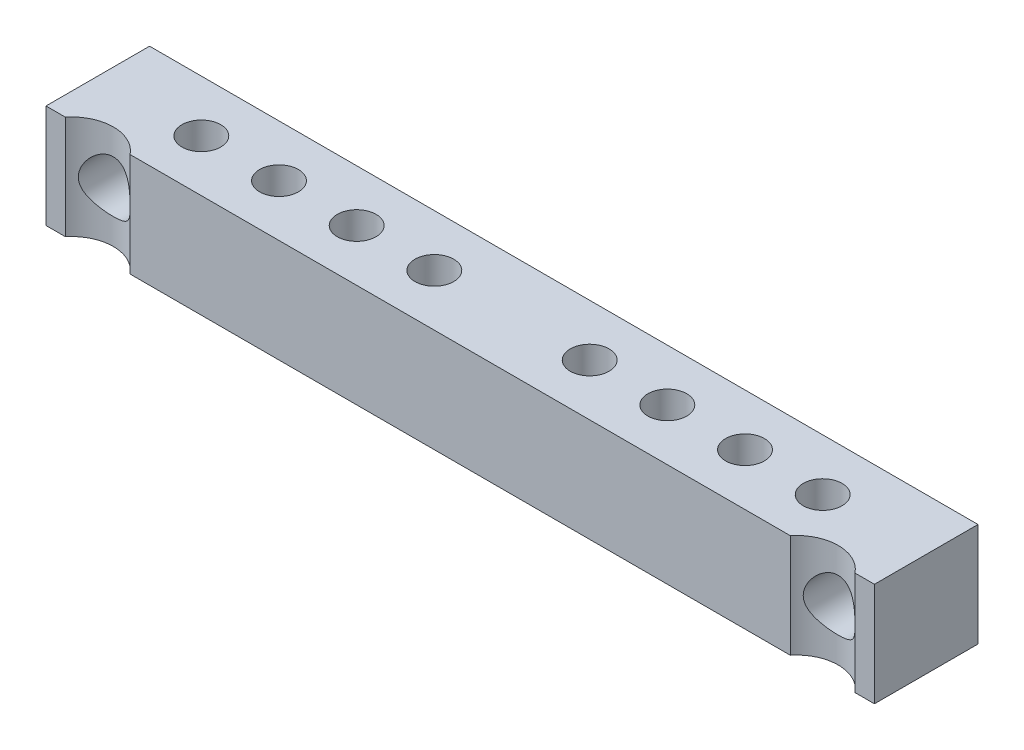
ISO-10303-21;
HEADER;
FILE_DESCRIPTION(('STEP AP214'),'2;1');
FILE_NAME('part.step','',(''),(''),'','','');
FILE_SCHEMA(('AUTOMOTIVE_DESIGN { 1 0 10303 214 1 1 1 1 }'));
ENDSEC;
DATA;
#1=APPLICATION_CONTEXT('core data for automotive mechanical design processes');
#2=APPLICATION_PROTOCOL_DEFINITION('international standard','automotive_design',2000,#1);
#3=PRODUCT_CONTEXT('',#1,'mechanical');
#4=PRODUCT('Part','Part','',(#3));
#5=PRODUCT_RELATED_PRODUCT_CATEGORY('part','',(#4));
#6=PRODUCT_DEFINITION_FORMATION('','',#4);
#7=PRODUCT_DEFINITION_CONTEXT('part definition',#1,'design');
#8=PRODUCT_DEFINITION('design','',#6,#7);
#9=PRODUCT_DEFINITION_SHAPE('','',#8);
#10=(LENGTH_UNIT() NAMED_UNIT(*) SI_UNIT(.MILLI.,.METRE.));
#11=(NAMED_UNIT(*) PLANE_ANGLE_UNIT() SI_UNIT($,.RADIAN.));
#12=(NAMED_UNIT(*) SI_UNIT($,.STERADIAN.) SOLID_ANGLE_UNIT());
#13=UNCERTAINTY_MEASURE_WITH_UNIT(LENGTH_MEASURE(1.E-05),#10,'distance_accuracy_value','');
#14=(GEOMETRIC_REPRESENTATION_CONTEXT(3) GLOBAL_UNCERTAINTY_ASSIGNED_CONTEXT((#13)) GLOBAL_UNIT_ASSIGNED_CONTEXT((#10,
#11,#12)) REPRESENTATION_CONTEXT('',''));
#15=CARTESIAN_POINT('',(0.,0.,0.));
#16=DIRECTION('',(0.,0.,1.));
#17=DIRECTION('',(1.,0.,0.));
#18=AXIS2_PLACEMENT_3D('',#15,#16,#17);
#19=CARTESIAN_POINT('',(0.,0.,4.));
#20=DIRECTION('',(0.,0.,-1.));
#21=DIRECTION('',(-1.,0.,0.));
#22=AXIS2_PLACEMENT_3D('',#19,#20,#21);
#23=PLANE('',#22);
#24=DIRECTION('',(-1.,0.,0.));
#25=VECTOR('',#24,1.);
#26=CARTESIAN_POINT('',(0.,4.,4.));
#27=LINE('',#26,#25);
#28=CARTESIAN_POINT('',(32.,4.,4.));
#29=VERTEX_POINT('',#28);
#30=CARTESIAN_POINT('',(31.2489995996797,4.,4.));
#31=VERTEX_POINT('',#30);
#32=EDGE_CURVE('E126',#29,#31,#27,.T.);
#33=ORIENTED_EDGE('',*,*,#32,.T.);
#34=DIRECTION('',(0.,-1.,0.));
#35=VECTOR('',#34,1.);
#36=CARTESIAN_POINT('',(31.2489995996797,4.,4.));
#37=LINE('',#36,#35);
#38=CARTESIAN_POINT('',(31.2489995996797,0.,4.));
#39=VERTEX_POINT('',#38);
#40=EDGE_CURVE('E63',#31,#39,#37,.T.);
#41=ORIENTED_EDGE('',*,*,#40,.T.);
#42=DIRECTION('',(1.,0.,0.));
#43=VECTOR('',#42,1.);
#44=CARTESIAN_POINT('',(0.,0.,4.));
#45=LINE('',#44,#43);
#46=CARTESIAN_POINT('',(32.,0.,4.));
#47=VERTEX_POINT('',#46);
#48=EDGE_CURVE('E221',#39,#47,#45,.T.);
#49=ORIENTED_EDGE('',*,*,#48,.T.);
#50=DIRECTION('',(0.,1.,0.));
#51=VECTOR('',#50,1.);
#52=CARTESIAN_POINT('',(32.,0.,4.));
#53=LINE('',#52,#51);
#54=EDGE_CURVE('E130',#47,#29,#53,.T.);
#55=ORIENTED_EDGE('',*,*,#54,.T.);
#56=EDGE_LOOP('',(#33,#41,#49,#55));
#57=FACE_BOUND('',#56,.T.);
#58=ADVANCED_FACE('F33',(#57),#23,.F.);
#59=CARTESIAN_POINT('',(3.24899959967968,0.,4.));
#60=VERTEX_POINT('',#59);
#61=CARTESIAN_POINT('',(28.7510004003203,0.,4.));
#62=VERTEX_POINT('',#61);
#63=EDGE_CURVE('E120',#60,#62,#45,.T.);
#64=ORIENTED_EDGE('',*,*,#63,.T.);
#65=DIRECTION('',(0.,-1.,0.));
#66=VECTOR('',#65,1.);
#67=CARTESIAN_POINT('',(28.7510004003203,4.,4.));
#68=LINE('',#67,#66);
#69=CARTESIAN_POINT('',(28.7510004003203,4.,4.));
#70=VERTEX_POINT('',#69);
#71=EDGE_CURVE('E105',#62,#70,#68,.F.);
#72=ORIENTED_EDGE('',*,*,#71,.T.);
#73=CARTESIAN_POINT('',(3.24899959967968,4.,4.));
#74=VERTEX_POINT('',#73);
#75=EDGE_CURVE('E118',#70,#74,#27,.T.);
#76=ORIENTED_EDGE('',*,*,#75,.T.);
#77=DIRECTION('',(0.,-1.,0.));
#78=VECTOR('',#77,1.);
#79=CARTESIAN_POINT('',(3.24899959967968,4.,4.));
#80=LINE('',#79,#78);
#81=EDGE_CURVE('E55',#74,#60,#80,.T.);
#82=ORIENTED_EDGE('',*,*,#81,.T.);
#83=EDGE_LOOP('',(#64,#72,#76,#82));
#84=FACE_BOUND('',#83,.T.);
#85=ADVANCED_FACE('F117',(#84),#23,.F.);
#86=CARTESIAN_POINT('',(0.,0.,4.));
#87=VERTEX_POINT('',#86);
#88=CARTESIAN_POINT('',(0.751000400320319,0.,4.));
#89=VERTEX_POINT('',#88);
#90=EDGE_CURVE('E215',#87,#89,#45,.T.);
#91=ORIENTED_EDGE('',*,*,#90,.T.);
#92=DIRECTION('',(0.,-1.,0.));
#93=VECTOR('',#92,1.);
#94=CARTESIAN_POINT('',(0.751000400320319,4.,4.));
#95=LINE('',#94,#93);
#96=CARTESIAN_POINT('',(0.751000400320319,4.,4.));
#97=VERTEX_POINT('',#96);
#98=EDGE_CURVE('E216',#89,#97,#95,.F.);
#99=ORIENTED_EDGE('',*,*,#98,.T.);
#100=CARTESIAN_POINT('',(0.,4.,4.));
#101=VERTEX_POINT('',#100);
#102=EDGE_CURVE('E127',#97,#101,#27,.T.);
#103=ORIENTED_EDGE('',*,*,#102,.T.);
#104=DIRECTION('',(0.,-1.,0.));
#105=VECTOR('',#104,1.);
#106=CARTESIAN_POINT('',(0.,0.,4.));
#107=LINE('',#106,#105);
#108=EDGE_CURVE('E144',#101,#87,#107,.T.);
#109=ORIENTED_EDGE('',*,*,#108,.T.);
#110=EDGE_LOOP('',(#91,#99,#103,#109));
#111=FACE_BOUND('',#110,.T.);
#112=ADVANCED_FACE('F200',(#111),#23,.F.);
#113=CARTESIAN_POINT('',(0.,0.,0.));
#114=DIRECTION('',(0.,0.,-1.));
#115=DIRECTION('',(-1.,0.,0.));
#116=AXIS2_PLACEMENT_3D('',#113,#114,#115);
#117=PLANE('',#116);
#118=CARTESIAN_POINT('',(2.,2.,0.));
#119=DIRECTION('',(0.,0.,1.));
#120=DIRECTION('',(1.,0.,0.));
#121=AXIS2_PLACEMENT_3D('',#118,#119,#120);
#122=CIRCLE('',#121,1.);
#123=CARTESIAN_POINT('',(3.,2.,0.));
#124=VERTEX_POINT('',#123);
#125=EDGE_CURVE('E138',#124,#124,#122,.T.);
#126=ORIENTED_EDGE('',*,*,#125,.T.);
#127=EDGE_LOOP('',(#126));
#128=FACE_BOUND('',#127,.T.);
#129=DIRECTION('',(0.,-1.,0.));
#130=VECTOR('',#129,1.);
#131=CARTESIAN_POINT('',(0.,0.,0.));
#132=LINE('',#131,#130);
#133=CARTESIAN_POINT('',(0.,4.,0.));
#134=VERTEX_POINT('',#133);
#135=CARTESIAN_POINT('',(0.,0.,0.));
#136=VERTEX_POINT('',#135);
#137=EDGE_CURVE('E134',#134,#136,#132,.T.);
#138=ORIENTED_EDGE('',*,*,#137,.F.);
#139=DIRECTION('',(-1.,0.,0.));
#140=VECTOR('',#139,1.);
#141=CARTESIAN_POINT('',(0.,4.,0.));
#142=LINE('',#141,#140);
#143=CARTESIAN_POINT('',(32.,4.,0.));
#144=VERTEX_POINT('',#143);
#145=EDGE_CURVE('E142',#144,#134,#142,.T.);
#146=ORIENTED_EDGE('',*,*,#145,.F.);
#147=DIRECTION('',(0.,1.,0.));
#148=VECTOR('',#147,1.);
#149=CARTESIAN_POINT('',(32.,0.,0.));
#150=LINE('',#149,#148);
#151=CARTESIAN_POINT('',(32.,0.,0.));
#152=VERTEX_POINT('',#151);
#153=EDGE_CURVE('E140',#152,#144,#150,.T.);
#154=ORIENTED_EDGE('',*,*,#153,.F.);
#155=DIRECTION('',(1.,0.,0.));
#156=VECTOR('',#155,1.);
#157=CARTESIAN_POINT('',(0.,0.,0.));
#158=LINE('',#157,#156);
#159=EDGE_CURVE('E137',#136,#152,#158,.T.);
#160=ORIENTED_EDGE('',*,*,#159,.F.);
#161=EDGE_LOOP('',(#138,#146,#154,#160));
#162=FACE_BOUND('',#161,.T.);
#163=CARTESIAN_POINT('',(30.,2.,0.));
#164=DIRECTION('',(0.,0.,1.));
#165=DIRECTION('',(-1.,0.,0.));
#166=AXIS2_PLACEMENT_3D('',#163,#164,#165);
#167=CIRCLE('',#166,1.);
#168=CARTESIAN_POINT('',(29.,2.,0.));
#169=VERTEX_POINT('',#168);
#170=EDGE_CURVE('E228',#169,#169,#167,.T.);
#171=ORIENTED_EDGE('',*,*,#170,.T.);
#172=EDGE_LOOP('',(#171));
#173=FACE_BOUND('',#172,.T.);
#174=ADVANCED_FACE('F206',(#128,#162,#173),#117,.T.);
#175=CARTESIAN_POINT('',(0.,0.,4.));
#176=DIRECTION('',(1.,0.,0.));
#177=DIRECTION('',(0.,0.,-1.));
#178=AXIS2_PLACEMENT_3D('',#175,#176,#177);
#179=PLANE('',#178);
#180=ORIENTED_EDGE('',*,*,#137,.T.);
#181=DIRECTION('',(0.,0.,-1.));
#182=VECTOR('',#181,1.);
#183=CARTESIAN_POINT('',(0.,0.,4.));
#184=LINE('',#183,#182);
#185=EDGE_CURVE('E11',#87,#136,#184,.T.);
#186=ORIENTED_EDGE('',*,*,#185,.F.);
#187=ORIENTED_EDGE('',*,*,#108,.F.);
#188=DIRECTION('',(0.,0.,-1.));
#189=VECTOR('',#188,1.);
#190=CARTESIAN_POINT('',(0.,4.,4.));
#191=LINE('',#190,#189);
#192=EDGE_CURVE('E129',#101,#134,#191,.T.);
#193=ORIENTED_EDGE('',*,*,#192,.T.);
#194=EDGE_LOOP('',(#180,#186,#187,#193));
#195=FACE_BOUND('',#194,.T.);
#196=ADVANCED_FACE('F35',(#195),#179,.F.);
#197=CARTESIAN_POINT('',(0.,0.,4.));
#198=DIRECTION('',(0.,1.,0.));
#199=DIRECTION('',(-1.,0.,0.));
#200=AXIS2_PLACEMENT_3D('',#197,#198,#199);
#201=PLANE('',#200);
#202=CARTESIAN_POINT('',(4.,0.,1.99999999999994));
#203=DIRECTION('',(0.,-1.,0.));
#204=DIRECTION('',(0.,0.,-1.));
#205=AXIS2_PLACEMENT_3D('',#202,#203,#204);
#206=CIRCLE('',#205,0.750000000000001);
#207=CARTESIAN_POINT('',(4.,0.,1.24999999999994));
#208=VERTEX_POINT('',#207);
#209=EDGE_CURVE('E238',#208,#208,#206,.T.);
#210=ORIENTED_EDGE('',*,*,#209,.F.);
#211=EDGE_LOOP('',(#210));
#212=FACE_BOUND('',#211,.T.);
#213=CARTESIAN_POINT('',(13.,0.,2.));
#214=DIRECTION('',(0.,-1.,0.));
#215=DIRECTION('',(0.,0.,-1.));
#216=AXIS2_PLACEMENT_3D('',#213,#214,#215);
#217=CIRCLE('',#216,0.75);
#218=CARTESIAN_POINT('',(13.,0.,1.25));
#219=VERTEX_POINT('',#218);
#220=EDGE_CURVE('E264',#219,#219,#217,.T.);
#221=ORIENTED_EDGE('',*,*,#220,.F.);
#222=EDGE_LOOP('',(#221));
#223=FACE_BOUND('',#222,.T.);
#224=CARTESIAN_POINT('',(25.,0.,1.99999999999996));
#225=DIRECTION('',(0.,-1.,0.));
#226=DIRECTION('',(0.,0.,1.));
#227=AXIS2_PLACEMENT_3D('',#224,#225,#226);
#228=CIRCLE('',#227,0.750000000000002);
#229=CARTESIAN_POINT('',(25.,0.,2.74999999999996));
#230=VERTEX_POINT('',#229);
#231=EDGE_CURVE('E258',#230,#230,#228,.T.);
#232=ORIENTED_EDGE('',*,*,#231,.F.);
#233=EDGE_LOOP('',(#232));
#234=FACE_BOUND('',#233,.T.);
#235=CARTESIAN_POINT('',(10.,0.,1.99999999999998));
#236=DIRECTION('',(0.,-1.,0.));
#237=DIRECTION('',(0.,0.,-1.));
#238=AXIS2_PLACEMENT_3D('',#235,#236,#237);
#239=CIRCLE('',#238,0.75);
#240=CARTESIAN_POINT('',(10.,0.,1.24999999999998));
#241=VERTEX_POINT('',#240);
#242=EDGE_CURVE('E252',#241,#241,#239,.T.);
#243=ORIENTED_EDGE('',*,*,#242,.F.);
#244=EDGE_LOOP('',(#243));
#245=FACE_BOUND('',#244,.T.);
#246=CARTESIAN_POINT('',(7.,0.,1.99999999999996));
#247=DIRECTION('',(0.,-1.,0.));
#248=DIRECTION('',(0.,0.,-1.));
#249=AXIS2_PLACEMENT_3D('',#246,#247,#248);
#250=CIRCLE('',#249,0.75);
#251=CARTESIAN_POINT('',(7.,0.,1.24999999999996));
#252=VERTEX_POINT('',#251);
#253=EDGE_CURVE('E245',#252,#252,#250,.T.);
#254=ORIENTED_EDGE('',*,*,#253,.F.);
#255=EDGE_LOOP('',(#254));
#256=FACE_BOUND('',#255,.T.);
#257=CARTESIAN_POINT('',(22.,0.,1.99999999999998));
#258=DIRECTION('',(0.,-1.,0.));
#259=DIRECTION('',(0.,0.,1.));
#260=AXIS2_PLACEMENT_3D('',#257,#258,#259);
#261=CIRCLE('',#260,0.750000000000002);
#262=CARTESIAN_POINT('',(22.,0.,2.74999999999998));
#263=VERTEX_POINT('',#262);
#264=EDGE_CURVE('E280',#263,#263,#261,.T.);
#265=ORIENTED_EDGE('',*,*,#264,.F.);
#266=EDGE_LOOP('',(#265));
#267=FACE_BOUND('',#266,.T.);
#268=CARTESIAN_POINT('',(19.,0.,2.));
#269=DIRECTION('',(0.,-1.,0.));
#270=DIRECTION('',(0.,0.,1.));
#271=AXIS2_PLACEMENT_3D('',#268,#269,#270);
#272=CIRCLE('',#271,0.750000000000002);
#273=CARTESIAN_POINT('',(19.,0.,2.75));
#274=VERTEX_POINT('',#273);
#275=EDGE_CURVE('E111',#274,#274,#272,.T.);
#276=ORIENTED_EDGE('',*,*,#275,.F.);
#277=EDGE_LOOP('',(#276));
#278=FACE_BOUND('',#277,.T.);
#279=CARTESIAN_POINT('',(28.,0.,1.99999999999996));
#280=DIRECTION('',(0.,-1.,0.));
#281=DIRECTION('',(0.,0.,1.));
#282=AXIS2_PLACEMENT_3D('',#279,#280,#281);
#283=CIRCLE('',#282,0.750000000000002);
#284=CARTESIAN_POINT('',(28.,0.,2.74999999999996));
#285=VERTEX_POINT('',#284);
#286=EDGE_CURVE('E244',#285,#285,#283,.T.);
#287=ORIENTED_EDGE('',*,*,#286,.F.);
#288=EDGE_LOOP('',(#287));
#289=FACE_BOUND('',#288,.T.);
#290=ORIENTED_EDGE('',*,*,#48,.F.);
#291=CARTESIAN_POINT('',(30.,0.,5.));
#292=DIRECTION('',(0.,-1.,0.));
#293=DIRECTION('',(0.,0.,1.));
#294=AXIS2_PLACEMENT_3D('',#291,#292,#293);
#295=CIRCLE('',#294,1.60000000000001);
#296=EDGE_CURVE('E112',#62,#39,#295,.T.);
#297=ORIENTED_EDGE('',*,*,#296,.F.);
#298=ORIENTED_EDGE('',*,*,#63,.F.);
#299=CARTESIAN_POINT('',(2.,0.,5.));
#300=DIRECTION('',(0.,-1.,0.));
#301=DIRECTION('',(0.,0.,-1.));
#302=AXIS2_PLACEMENT_3D('',#299,#300,#301);
#303=CIRCLE('',#302,1.6);
#304=EDGE_CURVE('E234',#89,#60,#303,.T.);
#305=ORIENTED_EDGE('',*,*,#304,.F.);
#306=ORIENTED_EDGE('',*,*,#90,.F.);
#307=ORIENTED_EDGE('',*,*,#185,.T.);
#308=ORIENTED_EDGE('',*,*,#159,.T.);
#309=DIRECTION('',(0.,0.,-1.));
#310=VECTOR('',#309,1.);
#311=CARTESIAN_POINT('',(32.,0.,4.));
#312=LINE('',#311,#310);
#313=EDGE_CURVE('E47',#47,#152,#312,.T.);
#314=ORIENTED_EDGE('',*,*,#313,.F.);
#315=EDGE_LOOP('',(#290,#297,#298,#305,#306,#307,#308,#314));
#316=FACE_BOUND('',#315,.T.);
#317=ADVANCED_FACE('F292',(#212,#223,#234,#245,#256,#267,#278,#289,#316),#201,.F.);
#318=CARTESIAN_POINT('',(32.,0.,4.));
#319=DIRECTION('',(-1.,0.,0.));
#320=DIRECTION('',(0.,0.,1.));
#321=AXIS2_PLACEMENT_3D('',#318,#319,#320);
#322=PLANE('',#321);
#323=ORIENTED_EDGE('',*,*,#153,.T.);
#324=DIRECTION('',(0.,0.,-1.));
#325=VECTOR('',#324,1.);
#326=CARTESIAN_POINT('',(32.,4.,4.));
#327=LINE('',#326,#325);
#328=EDGE_CURVE('E147',#29,#144,#327,.T.);
#329=ORIENTED_EDGE('',*,*,#328,.F.);
#330=ORIENTED_EDGE('',*,*,#54,.F.);
#331=ORIENTED_EDGE('',*,*,#313,.T.);
#332=EDGE_LOOP('',(#323,#329,#330,#331));
#333=FACE_BOUND('',#332,.T.);
#334=ADVANCED_FACE('F295',(#333),#322,.F.);
#335=CARTESIAN_POINT('',(0.,4.,4.));
#336=DIRECTION('',(0.,-1.,0.));
#337=DIRECTION('',(1.,0.,0.));
#338=AXIS2_PLACEMENT_3D('',#335,#336,#337);
#339=PLANE('',#338);
#340=CARTESIAN_POINT('',(4.,4.,1.99999999999994));
#341=DIRECTION('',(0.,-1.,0.));
#342=DIRECTION('',(0.,0.,-1.));
#343=AXIS2_PLACEMENT_3D('',#340,#341,#342);
#344=CIRCLE('',#343,0.750000000000001);
#345=CARTESIAN_POINT('',(4.,4.,1.24999999999994));
#346=VERTEX_POINT('',#345);
#347=EDGE_CURVE('E241',#346,#346,#344,.T.);
#348=ORIENTED_EDGE('',*,*,#347,.T.);
#349=EDGE_LOOP('',(#348));
#350=FACE_BOUND('',#349,.T.);
#351=CARTESIAN_POINT('',(13.,4.,2.));
#352=DIRECTION('',(0.,-1.,0.));
#353=DIRECTION('',(0.,0.,-1.));
#354=AXIS2_PLACEMENT_3D('',#351,#352,#353);
#355=CIRCLE('',#354,0.75);
#356=CARTESIAN_POINT('',(13.,4.,1.25));
#357=VERTEX_POINT('',#356);
#358=EDGE_CURVE('E236',#357,#357,#355,.T.);
#359=ORIENTED_EDGE('',*,*,#358,.T.);
#360=EDGE_LOOP('',(#359));
#361=FACE_BOUND('',#360,.T.);
#362=CARTESIAN_POINT('',(25.,4.,1.99999999999996));
#363=DIRECTION('',(0.,-1.,0.));
#364=DIRECTION('',(0.,0.,1.));
#365=AXIS2_PLACEMENT_3D('',#362,#363,#364);
#366=CIRCLE('',#365,0.750000000000002);
#367=CARTESIAN_POINT('',(25.,4.,2.74999999999996));
#368=VERTEX_POINT('',#367);
#369=EDGE_CURVE('E261',#368,#368,#366,.T.);
#370=ORIENTED_EDGE('',*,*,#369,.T.);
#371=EDGE_LOOP('',(#370));
#372=FACE_BOUND('',#371,.T.);
#373=CARTESIAN_POINT('',(10.,4.,1.99999999999998));
#374=DIRECTION('',(0.,-1.,0.));
#375=DIRECTION('',(0.,0.,-1.));
#376=AXIS2_PLACEMENT_3D('',#373,#374,#375);
#377=CIRCLE('',#376,0.75);
#378=CARTESIAN_POINT('',(10.,4.,1.24999999999998));
#379=VERTEX_POINT('',#378);
#380=EDGE_CURVE('E255',#379,#379,#377,.T.);
#381=ORIENTED_EDGE('',*,*,#380,.T.);
#382=EDGE_LOOP('',(#381));
#383=FACE_BOUND('',#382,.T.);
#384=CARTESIAN_POINT('',(7.,4.,1.99999999999996));
#385=DIRECTION('',(0.,-1.,0.));
#386=DIRECTION('',(0.,0.,-1.));
#387=AXIS2_PLACEMENT_3D('',#384,#385,#386);
#388=CIRCLE('',#387,0.75);
#389=CARTESIAN_POINT('',(7.,4.,1.24999999999996));
#390=VERTEX_POINT('',#389);
#391=EDGE_CURVE('E248',#390,#390,#388,.T.);
#392=ORIENTED_EDGE('',*,*,#391,.T.);
#393=EDGE_LOOP('',(#392));
#394=FACE_BOUND('',#393,.T.);
#395=CARTESIAN_POINT('',(22.,4.,1.99999999999998));
#396=DIRECTION('',(0.,-1.,0.));
#397=DIRECTION('',(0.,0.,1.));
#398=AXIS2_PLACEMENT_3D('',#395,#396,#397);
#399=CIRCLE('',#398,0.750000000000002);
#400=CARTESIAN_POINT('',(22.,4.,2.74999999999998));
#401=VERTEX_POINT('',#400);
#402=EDGE_CURVE('E249',#401,#401,#399,.T.);
#403=ORIENTED_EDGE('',*,*,#402,.T.);
#404=EDGE_LOOP('',(#403));
#405=FACE_BOUND('',#404,.T.);
#406=CARTESIAN_POINT('',(19.,4.,2.));
#407=DIRECTION('',(0.,-1.,0.));
#408=DIRECTION('',(0.,0.,1.));
#409=AXIS2_PLACEMENT_3D('',#406,#407,#408);
#410=CIRCLE('',#409,0.750000000000002);
#411=CARTESIAN_POINT('',(19.,4.,2.75));
#412=VERTEX_POINT('',#411);
#413=EDGE_CURVE('E277',#412,#412,#410,.T.);
#414=ORIENTED_EDGE('',*,*,#413,.T.);
#415=EDGE_LOOP('',(#414));
#416=FACE_BOUND('',#415,.T.);
#417=CARTESIAN_POINT('',(28.,4.,1.99999999999996));
#418=DIRECTION('',(0.,-1.,0.));
#419=DIRECTION('',(0.,0.,1.));
#420=AXIS2_PLACEMENT_3D('',#417,#418,#419);
#421=CIRCLE('',#420,0.750000000000002);
#422=CARTESIAN_POINT('',(28.,4.,2.74999999999996));
#423=VERTEX_POINT('',#422);
#424=EDGE_CURVE('E271',#423,#423,#421,.T.);
#425=ORIENTED_EDGE('',*,*,#424,.T.);
#426=EDGE_LOOP('',(#425));
#427=FACE_BOUND('',#426,.T.);
#428=ORIENTED_EDGE('',*,*,#75,.F.);
#429=CARTESIAN_POINT('',(30.,4.,5.));
#430=DIRECTION('',(0.,-1.,0.));
#431=DIRECTION('',(0.,0.,1.));
#432=AXIS2_PLACEMENT_3D('',#429,#430,#431);
#433=CIRCLE('',#432,1.60000000000001);
#434=EDGE_CURVE('E102',#70,#31,#433,.T.);
#435=ORIENTED_EDGE('',*,*,#434,.T.);
#436=ORIENTED_EDGE('',*,*,#32,.F.);
#437=ORIENTED_EDGE('',*,*,#328,.T.);
#438=ORIENTED_EDGE('',*,*,#145,.T.);
#439=ORIENTED_EDGE('',*,*,#192,.F.);
#440=ORIENTED_EDGE('',*,*,#102,.F.);
#441=CARTESIAN_POINT('',(2.,4.,5.));
#442=DIRECTION('',(0.,-1.,0.));
#443=DIRECTION('',(0.,0.,-1.));
#444=AXIS2_PLACEMENT_3D('',#441,#442,#443);
#445=CIRCLE('',#444,1.6);
#446=EDGE_CURVE('E125',#97,#74,#445,.T.);
#447=ORIENTED_EDGE('',*,*,#446,.T.);
#448=EDGE_LOOP('',(#428,#435,#436,#437,#438,#439,#440,#447));
#449=FACE_BOUND('',#448,.T.);
#450=ADVANCED_FACE('F123',(#350,#361,#372,#383,#394,#405,#416,#427,#449),#339,.F.);
#451=CARTESIAN_POINT('',(2.,2.,4.));
#452=DIRECTION('',(0.,0.,-1.));
#453=DIRECTION('',(-1.,0.,0.));
#454=AXIS2_PLACEMENT_3D('',#451,#452,#453);
#455=CYLINDRICAL_SURFACE('',#454,1.);
#456=CARTESIAN_POINT('',(1.,2.,3.75100040032032));
#457=CARTESIAN_POINT('',(1.00000430231612,2.04969622544234,3.75099359941953));
#458=CARTESIAN_POINT('',(1.00373844920268,2.0994702682962,3.7479788583293));
#459=CARTESIAN_POINT('',(1.01840839333653,2.1973410560635,3.73645026235617));
#460=CARTESIAN_POINT('',(1.02936375655559,2.24543286909219,3.72792146828708));
#461=CARTESIAN_POINT('',(1.05769540870503,2.33822585815907,3.70679931736767));
#462=CARTESIAN_POINT('',(1.07501605333772,2.38295248694545,3.69424130065573));
#463=CARTESIAN_POINT('',(1.11542443550461,2.46880708931052,3.66653639428454));
#464=CARTESIAN_POINT('',(1.13851233035127,2.5099349646852,3.65138943401059));
#465=CARTESIAN_POINT('',(1.19340849657309,2.59349212358158,3.61776310900231));
#466=CARTESIAN_POINT('',(1.225971125046,2.63535579266607,3.59910929418123));
#467=CARTESIAN_POINT('',(1.2973530684025,2.71350615931597,3.56197743316098));
#468=CARTESIAN_POINT('',(1.33617777496207,2.74978799782714,3.54349955309336));
#469=CARTESIAN_POINT('',(1.42465066779321,2.8200828681185,3.50616436887192));
#470=CARTESIAN_POINT('',(1.47503954487155,2.85329413448344,3.4875302220684));
#471=CARTESIAN_POINT('',(1.58207674333015,2.91050016381053,3.45453414640688));
#472=CARTESIAN_POINT('',(1.63871879481741,2.934504052601,3.4401679905613));
#473=CARTESIAN_POINT('',(1.75057849731039,2.96998584848565,3.41864126945439));
#474=CARTESIAN_POINT('',(1.80535549116221,2.98248913311755,3.41089662062369));
#475=CARTESIAN_POINT('',(1.91671591947019,2.99810565571472,3.40119564496638));
#476=CARTESIAN_POINT('',(1.97329739154878,3.00122876489644,3.39923323325074));
#477=CARTESIAN_POINT('',(2.07845266273707,2.99811544857791,3.40117672713978));
#478=CARTESIAN_POINT('',(2.12708201861903,2.99307889895928,3.40433040150478));
#479=CARTESIAN_POINT('',(2.22264531672294,2.97610641250934,3.4148378219102));
#480=CARTESIAN_POINT('',(2.26957913051758,2.96416995420999,3.42219188539906));
#481=CARTESIAN_POINT('',(2.36071129366166,2.93391697992231,3.4404949310826));
#482=CARTESIAN_POINT('',(2.40490230039459,2.91558414076113,3.4514531066087));
#483=CARTESIAN_POINT('',(2.48961537637551,2.87322499579201,3.47611493688535));
#484=CARTESIAN_POINT('',(2.530136606848,2.84919739288752,3.48981921700619));
#485=CARTESIAN_POINT('',(2.61177081245363,2.79277746773651,3.52085420199365));
#486=CARTESIAN_POINT('',(2.65232987593516,2.75971629860613,3.53842396554284));
#487=CARTESIAN_POINT('',(2.7276788767244,2.6878940958213,3.5744362979821));
#488=CARTESIAN_POINT('',(2.76246027103171,2.64912477884276,3.59288010840663));
#489=CARTESIAN_POINT('',(2.82988356714345,2.56103550167512,3.63142846310243));
#490=CARTESIAN_POINT('',(2.86165292383957,2.51099889531976,3.65143534773444));
#491=CARTESIAN_POINT('',(2.91620922562647,2.40508310418126,3.6878868872368));
#492=CARTESIAN_POINT('',(2.93901271682686,2.34921492483567,3.70433807846656));
#493=CARTESIAN_POINT('',(2.96974853482533,2.2481844776897,3.72726498746304));
#494=CARTESIAN_POINT('',(2.98001473377377,2.20407122988986,3.73522636555782));
#495=CARTESIAN_POINT('',(2.99448134830019,2.11430784900086,3.74656688899388));
#496=CARTESIAN_POINT('',(2.9986900508262,2.06865990316808,3.74995229410057));
#497=CARTESIAN_POINT('',(3.00078828763607,1.97701705556779,3.75163093175868));
#498=CARTESIAN_POINT('',(2.99866334061261,1.93102159890735,3.74991249487652));
#499=CARTESIAN_POINT('',(2.9882058684479,1.84017553517472,3.74163165709836));
#500=CARTESIAN_POINT('',(2.9798682025621,1.79532590802966,3.73506524476275));
#501=CARTESIAN_POINT('',(2.95763948579864,1.70862529290736,3.71815951518434));
#502=CARTESIAN_POINT('',(2.94384224501431,1.66673706133479,3.70788417650263));
#503=CARTESIAN_POINT('',(2.91121961550818,1.58577013235442,3.68467541247327));
#504=CARTESIAN_POINT('',(2.89239244217137,1.54669243838041,3.67174104408073));
#505=CARTESIAN_POINT('',(2.84612301417856,1.46455516865838,3.6417023680885));
#506=CARTESIAN_POINT('',(2.81772299051377,1.42215396700054,3.62427299409368));
#507=CARTESIAN_POINT('',(2.75495221057989,1.34225195804868,3.58884833599431));
#508=CARTESIAN_POINT('',(2.72057525959728,1.30475630641763,3.57085248077317));
#509=CARTESIAN_POINT('',(2.64030452759936,1.22961340300548,3.53293468784822));
#510=CARTESIAN_POINT('',(2.59344795977133,1.19290515439386,3.51316636169922));
#511=CARTESIAN_POINT('',(2.49303999029566,1.12794507849932,3.47692600828));
#512=CARTESIAN_POINT('',(2.43949174299893,1.09968928802109,3.46045243736694));
#513=CARTESIAN_POINT('',(2.33034072050928,1.05440400703789,3.43352595233951));
#514=CARTESIAN_POINT('',(2.27505185803562,1.03680463482339,3.42277212328656));
#515=CARTESIAN_POINT('',(2.1614887991078,1.01141866505513,3.40714391929568));
#516=CARTESIAN_POINT('',(2.1032188505907,1.00361848819111,3.40226140853597));
#517=CARTESIAN_POINT('',(1.99472074240255,0.998762783968973,3.39922651401153));
#518=CARTESIAN_POINT('',(1.94457496192362,1.00029137857041,3.40018719501106));
#519=CARTESIAN_POINT('',(1.84537615112662,1.01076933997947,3.40671408032982));
#520=CARTESIAN_POINT('',(1.79632307132741,1.01971837006061,3.41228007566785));
#521=CARTESIAN_POINT('',(1.70236536425158,1.04412837990127,3.42723116248816));
#522=CARTESIAN_POINT('',(1.65737585545735,1.05935267189856,3.43647706022639));
#523=CARTESIAN_POINT('',(1.57062850471095,1.09564794253125,3.45804025058188));
#524=CARTESIAN_POINT('',(1.52887120950541,1.11671990758047,3.47035806134875));
#525=CARTESIAN_POINT('',(1.44507461002347,1.16652846319296,3.4985972620814));
#526=CARTESIAN_POINT('',(1.40345589827023,1.19583358505518,3.51475998026435));
#527=CARTESIAN_POINT('',(1.32542671331567,1.26006130426616,3.5485308763501));
#528=CARTESIAN_POINT('',(1.28902220555582,1.29499024019675,3.56614067415503));
#529=CARTESIAN_POINT('',(1.21702111895936,1.37529300984262,3.6039966792038));
#530=CARTESIAN_POINT('',(1.18229736100947,1.42144667614153,3.62425702842949));
#531=CARTESIAN_POINT('',(1.12098139995405,1.51971573280809,3.6626014280237));
#532=CARTESIAN_POINT('',(1.0943846995432,1.57182780392608,3.68068667866359));
#533=CARTESIAN_POINT('',(1.05520711261416,1.66912221434373,3.70856179135829));
#534=CARTESIAN_POINT('',(1.04083026978895,1.71330854470349,3.71930127720278));
#535=CARTESIAN_POINT('',(1.01829742255674,1.80397542236575,3.73648673249648));
#536=CARTESIAN_POINT('',(1.01012172603676,1.85044820401931,3.74294628479859));
#537=CARTESIAN_POINT('',(1.00352075053522,1.91442441909028,3.74818834888485));
#538=CARTESIAN_POINT('',(1.00220262992335,1.93149131641359,3.74923944362538));
#539=CARTESIAN_POINT('',(1.0004414021257,1.96570237321719,3.75064673043963));
#540=CARTESIAN_POINT('',(0.999998514986615,1.98284655104135,3.75100274776026));
#541=CARTESIAN_POINT('',(1.,2.,3.75100040032032));
#542=B_SPLINE_CURVE_WITH_KNOTS('',3,(#456,#457,#458,#459,#460,#461,#462,#463,#464,#465,#466,
#467,#468,#469,#470,#471,#472,#473,#474,#475,#476,#477,#478,#479,#480,#481,#482,#483,#484,#485,
#486,#487,#488,#489,#490,#491,#492,#493,#494,#495,#496,#497,#498,#499,#500,#501,#502,#503,#504,
#505,#506,#507,#508,#509,#510,#511,#512,#513,#514,#515,#516,#517,#518,#519,#520,#521,#522,#523,
#524,#525,#526,#527,#528,#529,#530,#531,#532,#533,#534,#535,#536,#537,#538,#539,#540,#541),
.UNSPECIFIED.,.T.,.F.,(4,2,2,2,2,2,2,2,2,2,2,2,2,2,2,2,2,2,2,2,2,2,2,2,2,2,2,2,2,2,2,2,2,2,2,2,
2,2,2,2,2,2,4),(0.,0.149009955209611,0.298425323517676,0.446564444904321,0.5947076075022,
0.762724965952059,0.930887767983289,1.11933788827565,1.30760074191408,1.47672330252318,
1.6456678247391,1.79193855666809,1.93822034461131,2.08487819860765,2.23156948902537,
2.39651603865686,2.56170435212948,2.74846454336657,2.93487844076222,3.07226220384214,
3.20945784005832,3.34696740192591,3.48459087328065,3.61994569874879,3.75534861189708,
3.91653066888103,4.07788078788203,4.26509278928711,4.452216872493,4.62816064395639,
4.80386033007169,4.95362881220099,5.10339049846866,5.24795655291539,5.39254700830304,
5.55214515286996,5.71192445567094,5.89473453936999,6.07744327668309,6.2199752181633,
6.36205262370708,6.41347287255598,6.46490604757618),.UNSPECIFIED.);
#543=CARTESIAN_POINT('',(1.,2.,3.75100040032032));
#544=VERTEX_POINT('',#543);
#545=EDGE_CURVE('E37',#544,#544,#542,.T.);
#546=ORIENTED_EDGE('',*,*,#545,.F.);
#547=EDGE_LOOP('',(#546));
#548=FACE_BOUND('',#547,.T.);
#549=ORIENTED_EDGE('',*,*,#125,.F.);
#550=EDGE_LOOP('',(#549));
#551=FACE_BOUND('',#550,.T.);
#552=ADVANCED_FACE('F331',(#548,#551),#455,.F.);
#553=CARTESIAN_POINT('',(30.,2.,4.));
#554=DIRECTION('',(0.,0.,-1.));
#555=DIRECTION('',(-1.,0.,0.));
#556=AXIS2_PLACEMENT_3D('',#553,#554,#555);
#557=CYLINDRICAL_SURFACE('',#556,1.);
#558=CARTESIAN_POINT('',(29.,2.,3.75100040032032));
#559=CARTESIAN_POINT('',(29.0000043023161,2.04969622544235,3.75099359941953));
#560=CARTESIAN_POINT('',(29.0037384492027,2.09947026829621,3.7479788583293));
#561=CARTESIAN_POINT('',(29.0184083933365,2.19734105606351,3.73645026235617));
#562=CARTESIAN_POINT('',(29.0293637565556,2.24543286909219,3.72792146828708));
#563=CARTESIAN_POINT('',(29.057695408705,2.33822585815908,3.70679931736767));
#564=CARTESIAN_POINT('',(29.0750160533377,2.38295248694545,3.69424130065573));
#565=CARTESIAN_POINT('',(29.1154244355046,2.46880708931053,3.66653639428454));
#566=CARTESIAN_POINT('',(29.1385123303513,2.50993496468521,3.65138943401059));
#567=CARTESIAN_POINT('',(29.1934084965731,2.59349212358159,3.61776310900231));
#568=CARTESIAN_POINT('',(29.225971125046,2.63535579266608,3.59910929418123));
#569=CARTESIAN_POINT('',(29.2973530684025,2.71350615931598,3.56197743316098));
#570=CARTESIAN_POINT('',(29.3361777749621,2.74978799782714,3.54349955309336));
#571=CARTESIAN_POINT('',(29.4246506677932,2.8200828681185,3.50616436887192));
#572=CARTESIAN_POINT('',(29.4750395448716,2.85329413448345,3.48753022206839));
#573=CARTESIAN_POINT('',(29.5820767433301,2.91050016381053,3.45453414640688));
#574=CARTESIAN_POINT('',(29.6387187948174,2.93450405260101,3.44016799056129));
#575=CARTESIAN_POINT('',(29.7505784973104,2.96998584848565,3.41864126945439));
#576=CARTESIAN_POINT('',(29.8053554911622,2.98248913311755,3.41089662062369));
#577=CARTESIAN_POINT('',(29.9167159194702,2.99810565571473,3.40119564496638));
#578=CARTESIAN_POINT('',(29.9732973915488,3.00122876489645,3.39923323325074));
#579=CARTESIAN_POINT('',(30.0784526627371,2.99811544857792,3.40117672713978));
#580=CARTESIAN_POINT('',(30.127082018619,2.99307889895928,3.40433040150478));
#581=CARTESIAN_POINT('',(30.2226453167229,2.97610641250935,3.4148378219102));
#582=CARTESIAN_POINT('',(30.2695791305176,2.96416995420999,3.42219188539906));
#583=CARTESIAN_POINT('',(30.3607112936617,2.93391697992231,3.4404949310826));
#584=CARTESIAN_POINT('',(30.4049023003946,2.91558414076113,3.4514531066087));
#585=CARTESIAN_POINT('',(30.4896153763755,2.87322499579201,3.47611493688535));
#586=CARTESIAN_POINT('',(30.530136606848,2.84919739288752,3.48981921700619));
#587=CARTESIAN_POINT('',(30.6117708124536,2.79277746773651,3.52085420199365));
#588=CARTESIAN_POINT('',(30.6523298759352,2.75971629860614,3.53842396554284));
#589=CARTESIAN_POINT('',(30.7276788767244,2.68789409582131,3.5744362979821));
#590=CARTESIAN_POINT('',(30.7624602710317,2.64912477884277,3.59288010840663));
#591=CARTESIAN_POINT('',(30.8298835671435,2.56103550167512,3.63142846310243));
#592=CARTESIAN_POINT('',(30.8616529238396,2.51099889531976,3.65143534773444));
#593=CARTESIAN_POINT('',(30.9162092256265,2.40508310418126,3.6878868872368));
#594=CARTESIAN_POINT('',(30.9390127168269,2.34921492483567,3.70433807846656));
#595=CARTESIAN_POINT('',(30.9697485348253,2.2481844776897,3.72726498746303));
#596=CARTESIAN_POINT('',(30.9800147337738,2.20407122988987,3.73522636555782));
#597=CARTESIAN_POINT('',(30.9944813483002,2.11430784900086,3.74656688899388));
#598=CARTESIAN_POINT('',(30.9986900508262,2.06865990316809,3.74995229410057));
#599=CARTESIAN_POINT('',(31.0007882876361,1.97701705556779,3.75163093175868));
#600=CARTESIAN_POINT('',(30.9986633406126,1.93102159890735,3.74991249487652));
#601=CARTESIAN_POINT('',(30.9882058684479,1.84017553517472,3.74163165709836));
#602=CARTESIAN_POINT('',(30.9798682025621,1.79532590802967,3.73506524476274));
#603=CARTESIAN_POINT('',(30.9576394857986,1.70862529290736,3.71815951518434));
#604=CARTESIAN_POINT('',(30.9438422450143,1.66673706133479,3.70788417650263));
#605=CARTESIAN_POINT('',(30.9112196155082,1.58577013235442,3.68467541247326));
#606=CARTESIAN_POINT('',(30.8923924421714,1.54669243838041,3.67174104408073));
#607=CARTESIAN_POINT('',(30.8461230141786,1.46455516865838,3.6417023680885));
#608=CARTESIAN_POINT('',(30.8177229905138,1.42215396700054,3.62427299409368));
#609=CARTESIAN_POINT('',(30.7549522105799,1.34225195804868,3.58884833599431));
#610=CARTESIAN_POINT('',(30.7205752595973,1.30475630641763,3.57085248077316));
#611=CARTESIAN_POINT('',(30.6403045275994,1.22961340300548,3.53293468784822));
#612=CARTESIAN_POINT('',(30.5934479597713,1.19290515439386,3.51316636169922));
#613=CARTESIAN_POINT('',(30.4930399902957,1.12794507849932,3.47692600828));
#614=CARTESIAN_POINT('',(30.4394917429989,1.09968928802109,3.46045243736694));
#615=CARTESIAN_POINT('',(30.3303407205093,1.05440400703789,3.43352595233951));
#616=CARTESIAN_POINT('',(30.2750518580356,1.03680463482339,3.42277212328656));
#617=CARTESIAN_POINT('',(30.1614887991078,1.01141866505513,3.40714391929568));
#618=CARTESIAN_POINT('',(30.1032188505907,1.00361848819111,3.40226140853597));
#619=CARTESIAN_POINT('',(29.9947207424025,0.998762783968975,3.39922651401153));
#620=CARTESIAN_POINT('',(29.9445749619236,1.00029137857041,3.40018719501106));
#621=CARTESIAN_POINT('',(29.8453761511266,1.01076933997947,3.40671408032982));
#622=CARTESIAN_POINT('',(29.7963230713274,1.01971837006062,3.41228007566785));
#623=CARTESIAN_POINT('',(29.7023653642516,1.04412837990128,3.42723116248816));
#624=CARTESIAN_POINT('',(29.6573758554573,1.05935267189856,3.43647706022639));
#625=CARTESIAN_POINT('',(29.5706285047109,1.09564794253126,3.45804025058188));
#626=CARTESIAN_POINT('',(29.5288712095054,1.11671990758047,3.47035806134875));
#627=CARTESIAN_POINT('',(29.4450746100235,1.16652846319296,3.4985972620814));
#628=CARTESIAN_POINT('',(29.4034558982702,1.19583358505519,3.51475998026435));
#629=CARTESIAN_POINT('',(29.3254267133157,1.26006130426616,3.54853087635009));
#630=CARTESIAN_POINT('',(29.2890222055558,1.29499024019676,3.56614067415503));
#631=CARTESIAN_POINT('',(29.2170211189594,1.37529300984262,3.6039966792038));
#632=CARTESIAN_POINT('',(29.1822973610095,1.42144667614154,3.62425702842949));
#633=CARTESIAN_POINT('',(29.120981399954,1.5197157328081,3.6626014280237));
#634=CARTESIAN_POINT('',(29.0943846995432,1.57182780392608,3.68068667866359));
#635=CARTESIAN_POINT('',(29.0552071126142,1.66912221434374,3.70856179135829));
#636=CARTESIAN_POINT('',(29.0408302697889,1.71330854470349,3.71930127720278));
#637=CARTESIAN_POINT('',(29.0182974225567,1.80397542236576,3.73648673249648));
#638=CARTESIAN_POINT('',(29.0101217260368,1.85044820401932,3.74294628479859));
#639=CARTESIAN_POINT('',(29.0035207505352,1.91442441909029,3.74818834888484));
#640=CARTESIAN_POINT('',(29.0022026299233,1.9314913164136,3.74923944362538));
#641=CARTESIAN_POINT('',(29.0004414021257,1.96570237321719,3.75064673043962));
#642=CARTESIAN_POINT('',(28.9999985149866,1.98284655104135,3.75100274776026));
#643=CARTESIAN_POINT('',(29.,2.,3.75100040032032));
#644=B_SPLINE_CURVE_WITH_KNOTS('',3,(#558,#559,#560,#561,#562,#563,#564,#565,#566,#567,#568,
#569,#570,#571,#572,#573,#574,#575,#576,#577,#578,#579,#580,#581,#582,#583,#584,#585,#586,#587,
#588,#589,#590,#591,#592,#593,#594,#595,#596,#597,#598,#599,#600,#601,#602,#603,#604,#605,#606,
#607,#608,#609,#610,#611,#612,#613,#614,#615,#616,#617,#618,#619,#620,#621,#622,#623,#624,#625,
#626,#627,#628,#629,#630,#631,#632,#633,#634,#635,#636,#637,#638,#639,#640,#641,#642,#643),
.UNSPECIFIED.,.T.,.F.,(4,2,2,2,2,2,2,2,2,2,2,2,2,2,2,2,2,2,2,2,2,2,2,2,2,2,2,2,2,2,2,2,2,2,2,2,
2,2,2,2,2,2,4),(0.,0.149009955209612,0.298425323517677,0.44656444490432,0.5947076075022,
0.762724965952058,0.93088776798329,1.11933788827566,1.30760074191408,1.47672330252318,
1.6456678247391,1.79193855666809,1.93822034461132,2.08487819860766,2.23156948902538,
2.39651603865686,2.56170435212949,2.74846454336657,2.93487844076222,3.07226220384215,
3.20945784005832,3.34696740192592,3.48459087328065,3.61994569874879,3.75534861189709,
3.91653066888103,4.07788078788204,4.26509278928712,4.45221687249301,4.6281606439564,
4.8038603300717,4.953628812201,5.10339049846867,5.2479565529154,5.39254700830305,
5.55214515286997,5.71192445567095,5.89473453937,6.0774432766831,6.21997521816331,
6.36205262370709,6.41347287255599,6.46490604757619),.UNSPECIFIED.);
#645=CARTESIAN_POINT('',(29.,2.,3.75100040032032));
#646=VERTEX_POINT('',#645);
#647=EDGE_CURVE('E121',#646,#646,#644,.T.);
#648=ORIENTED_EDGE('',*,*,#647,.F.);
#649=EDGE_LOOP('',(#648));
#650=FACE_BOUND('',#649,.T.);
#651=ORIENTED_EDGE('',*,*,#170,.F.);
#652=EDGE_LOOP('',(#651));
#653=FACE_BOUND('',#652,.T.);
#654=ADVANCED_FACE('F157',(#650,#653),#557,.F.);
#655=CARTESIAN_POINT('',(30.,4.,5.));
#656=DIRECTION('',(0.,-1.,0.));
#657=DIRECTION('',(0.,0.,-1.));
#658=AXIS2_PLACEMENT_3D('',#655,#656,#657);
#659=CYLINDRICAL_SURFACE('',#658,1.60000000000001);
#660=ORIENTED_EDGE('',*,*,#647,.T.);
#661=EDGE_LOOP('',(#660));
#662=FACE_BOUND('',#661,.T.);
#663=ORIENTED_EDGE('',*,*,#434,.F.);
#664=ORIENTED_EDGE('',*,*,#71,.F.);
#665=ORIENTED_EDGE('',*,*,#296,.T.);
#666=ORIENTED_EDGE('',*,*,#40,.F.);
#667=EDGE_LOOP('',(#663,#664,#665,#666));
#668=FACE_BOUND('',#667,.T.);
#669=ADVANCED_FACE('F104',(#662,#668),#659,.F.);
#670=CARTESIAN_POINT('',(2.,4.,5.));
#671=DIRECTION('',(0.,-1.,0.));
#672=DIRECTION('',(0.,0.,-1.));
#673=AXIS2_PLACEMENT_3D('',#670,#671,#672);
#674=CYLINDRICAL_SURFACE('',#673,1.6);
#675=ORIENTED_EDGE('',*,*,#545,.T.);
#676=EDGE_LOOP('',(#675));
#677=FACE_BOUND('',#676,.T.);
#678=ORIENTED_EDGE('',*,*,#446,.F.);
#679=ORIENTED_EDGE('',*,*,#98,.F.);
#680=ORIENTED_EDGE('',*,*,#304,.T.);
#681=ORIENTED_EDGE('',*,*,#81,.F.);
#682=EDGE_LOOP('',(#678,#679,#680,#681));
#683=FACE_BOUND('',#682,.T.);
#684=ADVANCED_FACE('F163',(#677,#683),#674,.F.);
#685=CARTESIAN_POINT('',(28.,4.,1.99999999999996));
#686=DIRECTION('',(0.,-1.,0.));
#687=DIRECTION('',(0.,0.,-1.));
#688=AXIS2_PLACEMENT_3D('',#685,#686,#687);
#689=CYLINDRICAL_SURFACE('',#688,0.750000000000002);
#690=ORIENTED_EDGE('',*,*,#424,.F.);
#691=EDGE_LOOP('',(#690));
#692=FACE_BOUND('',#691,.T.);
#693=ORIENTED_EDGE('',*,*,#286,.T.);
#694=EDGE_LOOP('',(#693));
#695=FACE_BOUND('',#694,.T.);
#696=ADVANCED_FACE('F167',(#692,#695),#689,.F.);
#697=CARTESIAN_POINT('',(19.,4.,2.));
#698=DIRECTION('',(0.,-1.,0.));
#699=DIRECTION('',(0.,0.,-1.));
#700=AXIS2_PLACEMENT_3D('',#697,#698,#699);
#701=CYLINDRICAL_SURFACE('',#700,0.750000000000002);
#702=ORIENTED_EDGE('',*,*,#413,.F.);
#703=EDGE_LOOP('',(#702));
#704=FACE_BOUND('',#703,.T.);
#705=ORIENTED_EDGE('',*,*,#275,.T.);
#706=EDGE_LOOP('',(#705));
#707=FACE_BOUND('',#706,.T.);
#708=ADVANCED_FACE('F165',(#704,#707),#701,.F.);
#709=CARTESIAN_POINT('',(22.,4.,1.99999999999998));
#710=DIRECTION('',(0.,-1.,0.));
#711=DIRECTION('',(0.,0.,-1.));
#712=AXIS2_PLACEMENT_3D('',#709,#710,#711);
#713=CYLINDRICAL_SURFACE('',#712,0.750000000000002);
#714=ORIENTED_EDGE('',*,*,#402,.F.);
#715=EDGE_LOOP('',(#714));
#716=FACE_BOUND('',#715,.T.);
#717=ORIENTED_EDGE('',*,*,#264,.T.);
#718=EDGE_LOOP('',(#717));
#719=FACE_BOUND('',#718,.T.);
#720=ADVANCED_FACE('F187',(#716,#719),#713,.F.);
#721=CARTESIAN_POINT('',(7.,4.,1.99999999999996));
#722=DIRECTION('',(0.,-1.,0.));
#723=DIRECTION('',(0.,0.,-1.));
#724=AXIS2_PLACEMENT_3D('',#721,#722,#723);
#725=CYLINDRICAL_SURFACE('',#724,0.75);
#726=ORIENTED_EDGE('',*,*,#391,.F.);
#727=EDGE_LOOP('',(#726));
#728=FACE_BOUND('',#727,.T.);
#729=ORIENTED_EDGE('',*,*,#253,.T.);
#730=EDGE_LOOP('',(#729));
#731=FACE_BOUND('',#730,.T.);
#732=ADVANCED_FACE('F183',(#728,#731),#725,.F.);
#733=CARTESIAN_POINT('',(10.,4.,1.99999999999998));
#734=DIRECTION('',(0.,-1.,0.));
#735=DIRECTION('',(0.,0.,-1.));
#736=AXIS2_PLACEMENT_3D('',#733,#734,#735);
#737=CYLINDRICAL_SURFACE('',#736,0.75);
#738=ORIENTED_EDGE('',*,*,#380,.F.);
#739=EDGE_LOOP('',(#738));
#740=FACE_BOUND('',#739,.T.);
#741=ORIENTED_EDGE('',*,*,#242,.T.);
#742=EDGE_LOOP('',(#741));
#743=FACE_BOUND('',#742,.T.);
#744=ADVANCED_FACE('F179',(#740,#743),#737,.F.);
#745=CARTESIAN_POINT('',(25.,4.,1.99999999999996));
#746=DIRECTION('',(0.,-1.,0.));
#747=DIRECTION('',(0.,0.,-1.));
#748=AXIS2_PLACEMENT_3D('',#745,#746,#747);
#749=CYLINDRICAL_SURFACE('',#748,0.750000000000002);
#750=ORIENTED_EDGE('',*,*,#369,.F.);
#751=EDGE_LOOP('',(#750));
#752=FACE_BOUND('',#751,.T.);
#753=ORIENTED_EDGE('',*,*,#231,.T.);
#754=EDGE_LOOP('',(#753));
#755=FACE_BOUND('',#754,.T.);
#756=ADVANCED_FACE('F175',(#752,#755),#749,.F.);
#757=CARTESIAN_POINT('',(13.,4.,2.));
#758=DIRECTION('',(0.,-1.,0.));
#759=DIRECTION('',(0.,0.,-1.));
#760=AXIS2_PLACEMENT_3D('',#757,#758,#759);
#761=CYLINDRICAL_SURFACE('',#760,0.75);
#762=ORIENTED_EDGE('',*,*,#358,.F.);
#763=EDGE_LOOP('',(#762));
#764=FACE_BOUND('',#763,.T.);
#765=ORIENTED_EDGE('',*,*,#220,.T.);
#766=EDGE_LOOP('',(#765));
#767=FACE_BOUND('',#766,.T.);
#768=ADVANCED_FACE('F171',(#764,#767),#761,.F.);
#769=CARTESIAN_POINT('',(4.,4.,1.99999999999994));
#770=DIRECTION('',(0.,-1.,0.));
#771=DIRECTION('',(0.,0.,-1.));
#772=AXIS2_PLACEMENT_3D('',#769,#770,#771);
#773=CYLINDRICAL_SURFACE('',#772,0.750000000000001);
#774=ORIENTED_EDGE('',*,*,#347,.F.);
#775=EDGE_LOOP('',(#774));
#776=FACE_BOUND('',#775,.T.);
#777=ORIENTED_EDGE('',*,*,#209,.T.);
#778=EDGE_LOOP('',(#777));
#779=FACE_BOUND('',#778,.T.);
#780=ADVANCED_FACE('F174',(#776,#779),#773,.F.);
#781=CLOSED_SHELL('',(#58,#85,#112,#174,#196,#317,#334,#450,#552,#654,#669,#684,#696,#708,#720,
#732,#744,#756,#768,#780));
#782=MANIFOLD_SOLID_BREP('B2',#781);
#783=ADVANCED_BREP_SHAPE_REPRESENTATION('',(#18,#782),#14);
#784=SHAPE_DEFINITION_REPRESENTATION(#9,#783);
ENDSEC;
END-ISO-10303-21;
